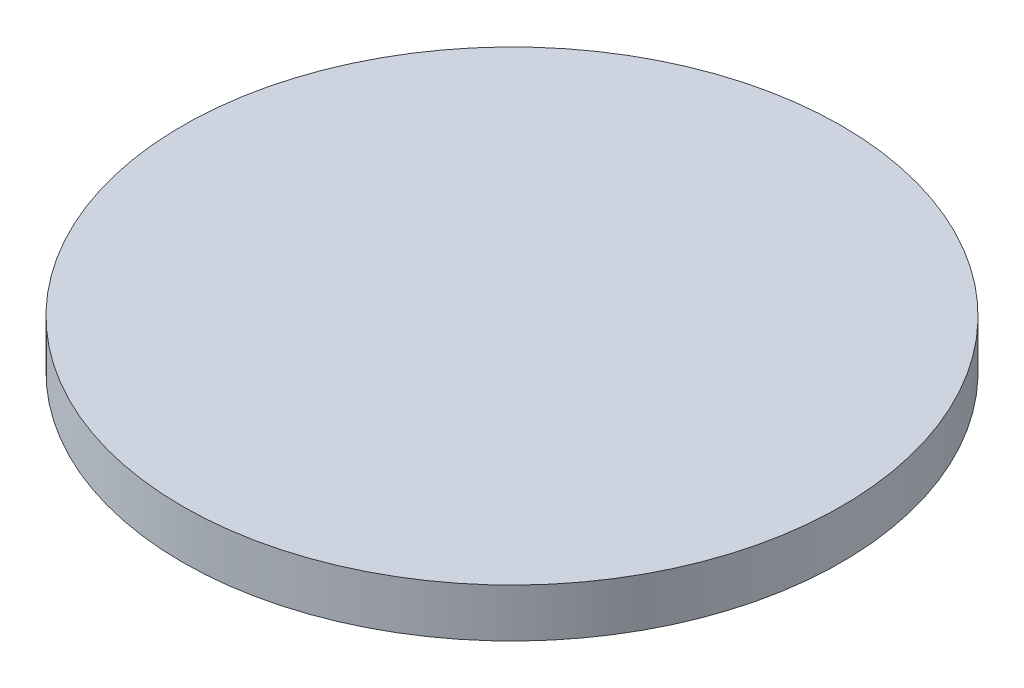
ISO-10303-21;
HEADER;
FILE_DESCRIPTION(('STEP AP214'),'2;1');
FILE_NAME('part.step','',(''),(''),'','','');
FILE_SCHEMA(('AUTOMOTIVE_DESIGN { 1 0 10303 214 1 1 1 1 }'));
ENDSEC;
DATA;
#1=APPLICATION_CONTEXT('core data for automotive mechanical design processes');
#2=APPLICATION_PROTOCOL_DEFINITION('international standard','automotive_design',2000,#1);
#3=PRODUCT_CONTEXT('',#1,'mechanical');
#4=PRODUCT('Part','Part','',(#3));
#5=PRODUCT_RELATED_PRODUCT_CATEGORY('part','',(#4));
#6=PRODUCT_DEFINITION_FORMATION('','',#4);
#7=PRODUCT_DEFINITION_CONTEXT('part definition',#1,'design');
#8=PRODUCT_DEFINITION('design','',#6,#7);
#9=PRODUCT_DEFINITION_SHAPE('','',#8);
#10=(LENGTH_UNIT() NAMED_UNIT(*) SI_UNIT(.MILLI.,.METRE.));
#11=(NAMED_UNIT(*) PLANE_ANGLE_UNIT() SI_UNIT($,.RADIAN.));
#12=(NAMED_UNIT(*) SI_UNIT($,.STERADIAN.) SOLID_ANGLE_UNIT());
#13=UNCERTAINTY_MEASURE_WITH_UNIT(LENGTH_MEASURE(1.E-05),#10,'distance_accuracy_value','');
#14=(GEOMETRIC_REPRESENTATION_CONTEXT(3) GLOBAL_UNCERTAINTY_ASSIGNED_CONTEXT((#13)) GLOBAL_UNIT_ASSIGNED_CONTEXT((#10,
#11,#12)) REPRESENTATION_CONTEXT('',''));
#15=CARTESIAN_POINT('',(0.,0.,0.));
#16=DIRECTION('',(0.,0.,1.));
#17=DIRECTION('',(1.,0.,0.));
#18=AXIS2_PLACEMENT_3D('',#15,#16,#17);
#19=CARTESIAN_POINT('',(0.,0.,0.));
#20=DIRECTION('',(0.,1.,0.));
#21=DIRECTION('',(0.,0.,1.));
#22=AXIS2_PLACEMENT_3D('',#19,#20,#21);
#23=PLANE('',#22);
#24=CARTESIAN_POINT('',(0.,0.,0.));
#25=DIRECTION('',(0.,-1.,0.));
#26=DIRECTION('',(0.,0.,-1.));
#27=AXIS2_PLACEMENT_3D('',#24,#25,#26);
#28=CIRCLE('',#27,10.795);
#29=CARTESIAN_POINT('',(0.,0.,-10.795));
#30=VERTEX_POINT('',#29);
#31=EDGE_CURVE('E17',#30,#30,#28,.F.);
#32=ORIENTED_EDGE('',*,*,#31,.F.);
#33=EDGE_LOOP('',(#32));
#34=FACE_BOUND('',#33,.T.);
#35=ADVANCED_FACE('F14',(#34),#23,.F.);
#36=CARTESIAN_POINT('',(0.,1.5875,0.));
#37=DIRECTION('',(0.,-1.,0.));
#38=DIRECTION('',(0.,0.,-1.));
#39=AXIS2_PLACEMENT_3D('',#36,#37,#38);
#40=CYLINDRICAL_SURFACE('',#39,10.795);
#41=ORIENTED_EDGE('',*,*,#31,.T.);
#42=EDGE_LOOP('',(#41));
#43=FACE_BOUND('',#42,.T.);
#44=CARTESIAN_POINT('',(0.,1.5875,0.));
#45=DIRECTION('',(0.,-1.,0.));
#46=DIRECTION('',(0.,0.,-1.));
#47=AXIS2_PLACEMENT_3D('',#44,#45,#46);
#48=CIRCLE('',#47,10.795);
#49=CARTESIAN_POINT('',(0.,1.5875,-10.795));
#50=VERTEX_POINT('',#49);
#51=EDGE_CURVE('E9',#50,#50,#48,.F.);
#52=ORIENTED_EDGE('',*,*,#51,.F.);
#53=EDGE_LOOP('',(#52));
#54=FACE_BOUND('',#53,.T.);
#55=ADVANCED_FACE('F26',(#43,#54),#40,.T.);
#56=CARTESIAN_POINT('',(0.,1.5875,0.));
#57=DIRECTION('',(0.,1.,0.));
#58=DIRECTION('',(0.,0.,1.));
#59=AXIS2_PLACEMENT_3D('',#56,#57,#58);
#60=PLANE('',#59);
#61=ORIENTED_EDGE('',*,*,#51,.T.);
#62=EDGE_LOOP('',(#61));
#63=FACE_BOUND('',#62,.T.);
#64=ADVANCED_FACE('F34',(#63),#60,.T.);
#65=CLOSED_SHELL('',(#35,#55,#64));
#66=MANIFOLD_SOLID_BREP('B1',#65);
#67=ADVANCED_BREP_SHAPE_REPRESENTATION('',(#18,#66),#14);
#68=SHAPE_DEFINITION_REPRESENTATION(#9,#67);
ENDSEC;
END-ISO-10303-21;
